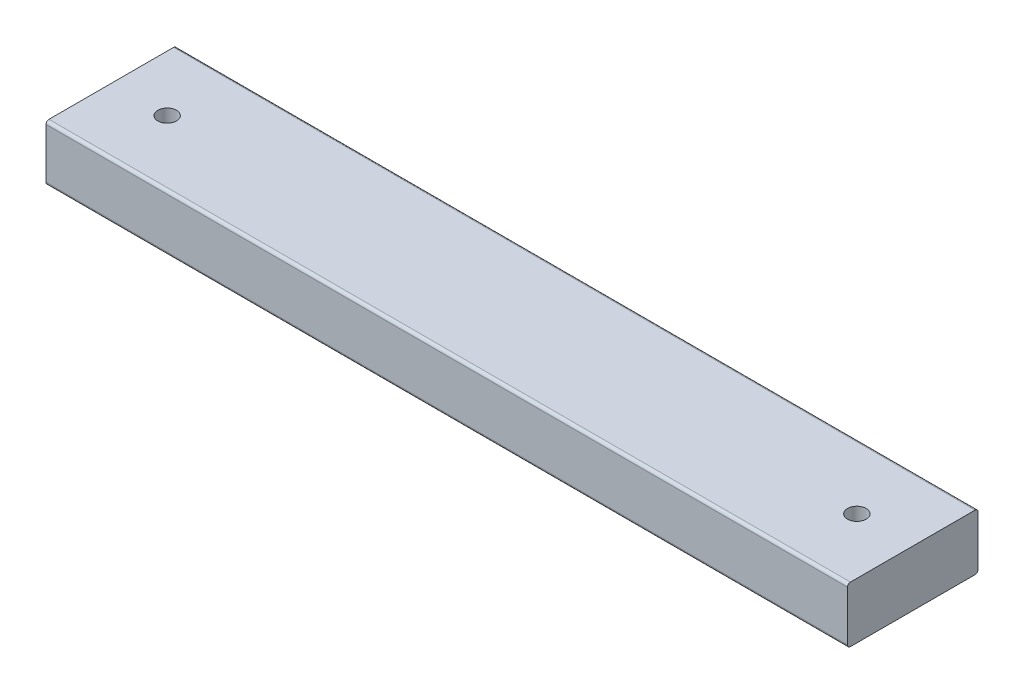
ISO-10303-21;
HEADER;
FILE_DESCRIPTION(('STEP AP214'),'2;1');
FILE_NAME('part.step','',(''),(''),'','','');
FILE_SCHEMA(('AUTOMOTIVE_DESIGN { 1 0 10303 214 1 1 1 1 }'));
ENDSEC;
DATA;
#1=APPLICATION_CONTEXT('core data for automotive mechanical design processes');
#2=APPLICATION_PROTOCOL_DEFINITION('international standard','automotive_design',2000,#1);
#3=PRODUCT_CONTEXT('',#1,'mechanical');
#4=PRODUCT('Part','Part','',(#3));
#5=PRODUCT_RELATED_PRODUCT_CATEGORY('part','',(#4));
#6=PRODUCT_DEFINITION_FORMATION('','',#4);
#7=PRODUCT_DEFINITION_CONTEXT('part definition',#1,'design');
#8=PRODUCT_DEFINITION('design','',#6,#7);
#9=PRODUCT_DEFINITION_SHAPE('','',#8);
#10=(LENGTH_UNIT() NAMED_UNIT(*) SI_UNIT(.MILLI.,.METRE.));
#11=(NAMED_UNIT(*) PLANE_ANGLE_UNIT() SI_UNIT($,.RADIAN.));
#12=(NAMED_UNIT(*) SI_UNIT($,.STERADIAN.) SOLID_ANGLE_UNIT());
#13=UNCERTAINTY_MEASURE_WITH_UNIT(LENGTH_MEASURE(1.E-05),#10,'distance_accuracy_value','');
#14=(GEOMETRIC_REPRESENTATION_CONTEXT(3) GLOBAL_UNCERTAINTY_ASSIGNED_CONTEXT((#13)) GLOBAL_UNIT_ASSIGNED_CONTEXT((#10,
#11,#12)) REPRESENTATION_CONTEXT('',''));
#15=CARTESIAN_POINT('',(0.,0.,0.));
#16=DIRECTION('',(0.,0.,1.));
#17=DIRECTION('',(1.,0.,0.));
#18=AXIS2_PLACEMENT_3D('',#15,#16,#17);
#19=CARTESIAN_POINT('',(546.1,-19.05,-44.45));
#20=DIRECTION('',(0.,0.,1.));
#21=DIRECTION('',(1.,0.,0.));
#22=AXIS2_PLACEMENT_3D('',#19,#20,#21);
#23=PLANE('',#22);
#24=DIRECTION('',(0.,1.,0.));
#25=VECTOR('',#24,1.);
#26=CARTESIAN_POINT('',(0.,-19.05,-44.45));
#27=LINE('',#26,#25);
#28=CARTESIAN_POINT('',(0.,-17.05,-44.45));
#29=VERTEX_POINT('',#28);
#30=CARTESIAN_POINT('',(0.,17.05,-44.45));
#31=VERTEX_POINT('',#30);
#32=EDGE_CURVE('E129',#29,#31,#27,.T.);
#33=ORIENTED_EDGE('',*,*,#32,.T.);
#34=DIRECTION('',(-1.,0.,0.));
#35=VECTOR('',#34,1.);
#36=CARTESIAN_POINT('',(546.1,17.05,-44.45));
#37=LINE('',#36,#35);
#38=CARTESIAN_POINT('',(546.1,17.05,-44.45));
#39=VERTEX_POINT('',#38);
#40=EDGE_CURVE('E152',#31,#39,#37,.F.);
#41=ORIENTED_EDGE('',*,*,#40,.T.);
#42=DIRECTION('',(0.,1.,0.));
#43=VECTOR('',#42,1.);
#44=CARTESIAN_POINT('',(546.1,-19.05,-44.45));
#45=LINE('',#44,#43);
#46=CARTESIAN_POINT('',(546.1,-17.05,-44.45));
#47=VERTEX_POINT('',#46);
#48=EDGE_CURVE('E127',#47,#39,#45,.T.);
#49=ORIENTED_EDGE('',*,*,#48,.F.);
#50=DIRECTION('',(-1.,0.,0.));
#51=VECTOR('',#50,1.);
#52=CARTESIAN_POINT('',(546.1,-17.05,-44.45));
#53=LINE('',#52,#51);
#54=EDGE_CURVE('E149',#47,#29,#53,.T.);
#55=ORIENTED_EDGE('',*,*,#54,.T.);
#56=EDGE_LOOP('',(#33,#41,#49,#55));
#57=FACE_BOUND('',#56,.T.);
#58=ADVANCED_FACE('F34',(#57),#23,.F.);
#59=CARTESIAN_POINT('',(546.1,19.05,44.45));
#60=DIRECTION('',(0.,-1.,0.));
#61=DIRECTION('',(0.,0.,-1.));
#62=AXIS2_PLACEMENT_3D('',#59,#60,#61);
#63=PLANE('',#62);
#64=CARTESIAN_POINT('',(508.,19.05,0.));
#65=DIRECTION('',(0.,1.,0.));
#66=DIRECTION('',(0.,0.,1.));
#67=AXIS2_PLACEMENT_3D('',#64,#65,#66);
#68=CIRCLE('',#67,6.34999999999994);
#69=CARTESIAN_POINT('',(508.,19.05,6.34999999999993));
#70=VERTEX_POINT('',#69);
#71=EDGE_CURVE('E184',#70,#70,#68,.T.);
#72=ORIENTED_EDGE('',*,*,#71,.F.);
#73=EDGE_LOOP('',(#72));
#74=FACE_BOUND('',#73,.T.);
#75=CARTESIAN_POINT('',(38.1000000000002,19.05,0.));
#76=DIRECTION('',(0.,1.,0.));
#77=DIRECTION('',(0.,0.,1.));
#78=AXIS2_PLACEMENT_3D('',#75,#76,#77);
#79=CIRCLE('',#78,6.35);
#80=CARTESIAN_POINT('',(38.1000000000002,19.05,6.35));
#81=VERTEX_POINT('',#80);
#82=EDGE_CURVE('E173',#81,#81,#79,.T.);
#83=ORIENTED_EDGE('',*,*,#82,.F.);
#84=EDGE_LOOP('',(#83));
#85=FACE_BOUND('',#84,.T.);
#86=DIRECTION('',(0.,0.,1.));
#87=VECTOR('',#86,1.);
#88=CARTESIAN_POINT('',(0.,19.05,44.45));
#89=LINE('',#88,#87);
#90=CARTESIAN_POINT('',(0.,19.05,-42.45));
#91=VERTEX_POINT('',#90);
#92=CARTESIAN_POINT('',(0.,19.05,42.45));
#93=VERTEX_POINT('',#92);
#94=EDGE_CURVE('E125',#91,#93,#89,.T.);
#95=ORIENTED_EDGE('',*,*,#94,.T.);
#96=DIRECTION('',(-1.,0.,0.));
#97=VECTOR('',#96,1.);
#98=CARTESIAN_POINT('',(546.1,19.05,42.45));
#99=LINE('',#98,#97);
#100=CARTESIAN_POINT('',(546.1,19.05,42.45));
#101=VERTEX_POINT('',#100);
#102=EDGE_CURVE('E104',#93,#101,#99,.F.);
#103=ORIENTED_EDGE('',*,*,#102,.T.);
#104=DIRECTION('',(0.,0.,1.));
#105=VECTOR('',#104,1.);
#106=CARTESIAN_POINT('',(546.1,19.05,44.45));
#107=LINE('',#106,#105);
#108=CARTESIAN_POINT('',(546.1,19.05,-42.45));
#109=VERTEX_POINT('',#108);
#110=EDGE_CURVE('E168',#109,#101,#107,.T.);
#111=ORIENTED_EDGE('',*,*,#110,.F.);
#112=DIRECTION('',(-1.,0.,0.));
#113=VECTOR('',#112,1.);
#114=CARTESIAN_POINT('',(546.1,19.05,-42.45));
#115=LINE('',#114,#113);
#116=EDGE_CURVE('E109',#109,#91,#115,.T.);
#117=ORIENTED_EDGE('',*,*,#116,.T.);
#118=EDGE_LOOP('',(#95,#103,#111,#117));
#119=FACE_BOUND('',#118,.T.);
#120=ADVANCED_FACE('F198',(#74,#85,#119),#63,.F.);
#121=CARTESIAN_POINT('',(546.1,-19.05,44.45));
#122=DIRECTION('',(0.,0.,-1.));
#123=DIRECTION('',(-1.,0.,0.));
#124=AXIS2_PLACEMENT_3D('',#121,#122,#123);
#125=PLANE('',#124);
#126=DIRECTION('',(0.,-1.,0.));
#127=VECTOR('',#126,1.);
#128=CARTESIAN_POINT('',(546.1,-19.05,44.45));
#129=LINE('',#128,#127);
#130=CARTESIAN_POINT('',(546.1,17.05,44.45));
#131=VERTEX_POINT('',#130);
#132=CARTESIAN_POINT('',(546.1,-17.05,44.45));
#133=VERTEX_POINT('',#132);
#134=EDGE_CURVE('E118',#131,#133,#129,.T.);
#135=ORIENTED_EDGE('',*,*,#134,.F.);
#136=DIRECTION('',(-1.,0.,0.));
#137=VECTOR('',#136,1.);
#138=CARTESIAN_POINT('',(546.1,17.05,44.45));
#139=LINE('',#138,#137);
#140=CARTESIAN_POINT('',(0.,17.05,44.45));
#141=VERTEX_POINT('',#140);
#142=EDGE_CURVE('E103',#131,#141,#139,.T.);
#143=ORIENTED_EDGE('',*,*,#142,.T.);
#144=DIRECTION('',(0.,-1.,0.));
#145=VECTOR('',#144,1.);
#146=CARTESIAN_POINT('',(0.,-19.05,44.45));
#147=LINE('',#146,#145);
#148=CARTESIAN_POINT('',(0.,-17.05,44.45));
#149=VERTEX_POINT('',#148);
#150=EDGE_CURVE('E116',#141,#149,#147,.T.);
#151=ORIENTED_EDGE('',*,*,#150,.T.);
#152=DIRECTION('',(-1.,0.,0.));
#153=VECTOR('',#152,1.);
#154=CARTESIAN_POINT('',(546.1,-17.05,44.45));
#155=LINE('',#154,#153);
#156=EDGE_CURVE('E120',#149,#133,#155,.F.);
#157=ORIENTED_EDGE('',*,*,#156,.T.);
#158=EDGE_LOOP('',(#135,#143,#151,#157));
#159=FACE_BOUND('',#158,.T.);
#160=ADVANCED_FACE('F115',(#159),#125,.F.);
#161=CARTESIAN_POINT('',(546.1,-19.05,44.45));
#162=DIRECTION('',(0.,1.,0.));
#163=DIRECTION('',(0.,0.,1.));
#164=AXIS2_PLACEMENT_3D('',#161,#162,#163);
#165=PLANE('',#164);
#166=CARTESIAN_POINT('',(508.,-19.05,0.));
#167=DIRECTION('',(0.,1.,0.));
#168=DIRECTION('',(0.,0.,1.));
#169=AXIS2_PLACEMENT_3D('',#166,#167,#168);
#170=CIRCLE('',#169,6.34999999999994);
#171=CARTESIAN_POINT('',(508.,-19.05,6.34999999999993));
#172=VERTEX_POINT('',#171);
#173=EDGE_CURVE('E182',#172,#172,#170,.T.);
#174=ORIENTED_EDGE('',*,*,#173,.T.);
#175=EDGE_LOOP('',(#174));
#176=FACE_BOUND('',#175,.T.);
#177=CARTESIAN_POINT('',(38.1000000000002,-19.05,0.));
#178=DIRECTION('',(0.,1.,0.));
#179=DIRECTION('',(0.,0.,1.));
#180=AXIS2_PLACEMENT_3D('',#177,#178,#179);
#181=CIRCLE('',#180,6.35);
#182=CARTESIAN_POINT('',(38.1000000000002,-19.05,6.35));
#183=VERTEX_POINT('',#182);
#184=EDGE_CURVE('E177',#183,#183,#181,.T.);
#185=ORIENTED_EDGE('',*,*,#184,.T.);
#186=EDGE_LOOP('',(#185));
#187=FACE_BOUND('',#186,.T.);
#188=DIRECTION('',(0.,0.,-1.));
#189=VECTOR('',#188,1.);
#190=CARTESIAN_POINT('',(0.,-19.05,44.45));
#191=LINE('',#190,#189);
#192=CARTESIAN_POINT('',(0.,-19.05,42.45));
#193=VERTEX_POINT('',#192);
#194=CARTESIAN_POINT('',(0.,-19.05,-42.45));
#195=VERTEX_POINT('',#194);
#196=EDGE_CURVE('E124',#193,#195,#191,.T.);
#197=ORIENTED_EDGE('',*,*,#196,.T.);
#198=DIRECTION('',(-1.,0.,0.));
#199=VECTOR('',#198,1.);
#200=CARTESIAN_POINT('',(546.1,-19.05,-42.45));
#201=LINE('',#200,#199);
#202=CARTESIAN_POINT('',(546.1,-19.05,-42.45));
#203=VERTEX_POINT('',#202);
#204=EDGE_CURVE('E11',#195,#203,#201,.F.);
#205=ORIENTED_EDGE('',*,*,#204,.T.);
#206=DIRECTION('',(0.,0.,-1.));
#207=VECTOR('',#206,1.);
#208=CARTESIAN_POINT('',(546.1,-19.05,44.45));
#209=LINE('',#208,#207);
#210=CARTESIAN_POINT('',(546.1,-19.05,42.45));
#211=VERTEX_POINT('',#210);
#212=EDGE_CURVE('E133',#211,#203,#209,.T.);
#213=ORIENTED_EDGE('',*,*,#212,.F.);
#214=DIRECTION('',(-1.,0.,0.));
#215=VECTOR('',#214,1.);
#216=CARTESIAN_POINT('',(546.1,-19.05,42.45));
#217=LINE('',#216,#215);
#218=EDGE_CURVE('E42',#211,#193,#217,.T.);
#219=ORIENTED_EDGE('',*,*,#218,.T.);
#220=EDGE_LOOP('',(#197,#205,#213,#219));
#221=FACE_BOUND('',#220,.T.);
#222=ADVANCED_FACE('F155',(#176,#187,#221),#165,.F.);
#223=CARTESIAN_POINT('',(546.1,0.,0.));
#224=DIRECTION('',(-1.,0.,0.));
#225=DIRECTION('',(0.,0.,1.));
#226=AXIS2_PLACEMENT_3D('',#223,#224,#225);
#227=PLANE('',#226);
#228=ORIENTED_EDGE('',*,*,#110,.T.);
#229=CARTESIAN_POINT('',(546.1,17.05,42.45));
#230=DIRECTION('',(-1.,0.,0.));
#231=DIRECTION('',(0.,0.,1.));
#232=AXIS2_PLACEMENT_3D('',#229,#230,#231);
#233=CIRCLE('',#232,2.);
#234=EDGE_CURVE('E147',#101,#131,#233,.F.);
#235=ORIENTED_EDGE('',*,*,#234,.T.);
#236=ORIENTED_EDGE('',*,*,#134,.T.);
#237=CARTESIAN_POINT('',(546.1,-17.05,42.45));
#238=DIRECTION('',(-1.,0.,0.));
#239=DIRECTION('',(0.,0.,1.));
#240=AXIS2_PLACEMENT_3D('',#237,#238,#239);
#241=CIRCLE('',#240,2.);
#242=EDGE_CURVE('E54',#133,#211,#241,.F.);
#243=ORIENTED_EDGE('',*,*,#242,.T.);
#244=ORIENTED_EDGE('',*,*,#212,.T.);
#245=CARTESIAN_POINT('',(546.1,-17.05,-42.45));
#246=DIRECTION('',(-1.,0.,0.));
#247=DIRECTION('',(0.,0.,1.));
#248=AXIS2_PLACEMENT_3D('',#245,#246,#247);
#249=CIRCLE('',#248,2.);
#250=EDGE_CURVE('E143',#203,#47,#249,.F.);
#251=ORIENTED_EDGE('',*,*,#250,.T.);
#252=ORIENTED_EDGE('',*,*,#48,.T.);
#253=CARTESIAN_POINT('',(546.1,17.05,-42.45));
#254=DIRECTION('',(-1.,0.,0.));
#255=DIRECTION('',(0.,0.,1.));
#256=AXIS2_PLACEMENT_3D('',#253,#254,#255);
#257=CIRCLE('',#256,2.);
#258=EDGE_CURVE('E145',#39,#109,#257,.F.);
#259=ORIENTED_EDGE('',*,*,#258,.T.);
#260=EDGE_LOOP('',(#228,#235,#236,#243,#244,#251,#252,#259));
#261=FACE_BOUND('',#260,.T.);
#262=ADVANCED_FACE('F208',(#261),#227,.F.);
#263=CARTESIAN_POINT('',(0.,0.,0.));
#264=DIRECTION('',(-1.,0.,0.));
#265=DIRECTION('',(0.,0.,1.));
#266=AXIS2_PLACEMENT_3D('',#263,#264,#265);
#267=PLANE('',#266);
#268=ORIENTED_EDGE('',*,*,#150,.F.);
#269=CARTESIAN_POINT('',(0.,17.05,42.45));
#270=DIRECTION('',(-1.,0.,0.));
#271=DIRECTION('',(0.,0.,1.));
#272=AXIS2_PLACEMENT_3D('',#269,#270,#271);
#273=CIRCLE('',#272,2.);
#274=EDGE_CURVE('E99',#141,#93,#273,.T.);
#275=ORIENTED_EDGE('',*,*,#274,.T.);
#276=ORIENTED_EDGE('',*,*,#94,.F.);
#277=CARTESIAN_POINT('',(0.,17.05,-42.45));
#278=DIRECTION('',(-1.,0.,0.));
#279=DIRECTION('',(0.,0.,1.));
#280=AXIS2_PLACEMENT_3D('',#277,#278,#279);
#281=CIRCLE('',#280,2.);
#282=EDGE_CURVE('E110',#91,#31,#281,.T.);
#283=ORIENTED_EDGE('',*,*,#282,.T.);
#284=ORIENTED_EDGE('',*,*,#32,.F.);
#285=CARTESIAN_POINT('',(0.,-17.05,-42.45));
#286=DIRECTION('',(-1.,0.,0.));
#287=DIRECTION('',(0.,0.,1.));
#288=AXIS2_PLACEMENT_3D('',#285,#286,#287);
#289=CIRCLE('',#288,2.);
#290=EDGE_CURVE('E136',#29,#195,#289,.T.);
#291=ORIENTED_EDGE('',*,*,#290,.T.);
#292=ORIENTED_EDGE('',*,*,#196,.F.);
#293=CARTESIAN_POINT('',(0.,-17.05,42.45));
#294=DIRECTION('',(-1.,0.,0.));
#295=DIRECTION('',(0.,0.,1.));
#296=AXIS2_PLACEMENT_3D('',#293,#294,#295);
#297=CIRCLE('',#296,2.);
#298=EDGE_CURVE('E119',#193,#149,#297,.T.);
#299=ORIENTED_EDGE('',*,*,#298,.T.);
#300=EDGE_LOOP('',(#268,#275,#276,#283,#284,#291,#292,#299));
#301=FACE_BOUND('',#300,.T.);
#302=ADVANCED_FACE('F122',(#301),#267,.T.);
#303=CARTESIAN_POINT('',(546.1,17.05,42.45));
#304=DIRECTION('',(-1.,0.,0.));
#305=DIRECTION('',(0.,0.,1.));
#306=AXIS2_PLACEMENT_3D('',#303,#304,#305);
#307=CYLINDRICAL_SURFACE('',#306,2.);
#308=ORIENTED_EDGE('',*,*,#234,.F.);
#309=ORIENTED_EDGE('',*,*,#102,.F.);
#310=ORIENTED_EDGE('',*,*,#274,.F.);
#311=ORIENTED_EDGE('',*,*,#142,.F.);
#312=EDGE_LOOP('',(#308,#309,#310,#311));
#313=FACE_BOUND('',#312,.T.);
#314=ADVANCED_FACE('F102',(#313),#307,.T.);
#315=CARTESIAN_POINT('',(546.1,17.05,-42.45));
#316=DIRECTION('',(-1.,0.,0.));
#317=DIRECTION('',(0.,0.,1.));
#318=AXIS2_PLACEMENT_3D('',#315,#316,#317);
#319=CYLINDRICAL_SURFACE('',#318,2.);
#320=ORIENTED_EDGE('',*,*,#258,.F.);
#321=ORIENTED_EDGE('',*,*,#40,.F.);
#322=ORIENTED_EDGE('',*,*,#282,.F.);
#323=ORIENTED_EDGE('',*,*,#116,.F.);
#324=EDGE_LOOP('',(#320,#321,#322,#323));
#325=FACE_BOUND('',#324,.T.);
#326=ADVANCED_FACE('F207',(#325),#319,.T.);
#327=CARTESIAN_POINT('',(546.1,-17.05,-42.45));
#328=DIRECTION('',(-1.,0.,0.));
#329=DIRECTION('',(0.,0.,1.));
#330=AXIS2_PLACEMENT_3D('',#327,#328,#329);
#331=CYLINDRICAL_SURFACE('',#330,2.);
#332=ORIENTED_EDGE('',*,*,#250,.F.);
#333=ORIENTED_EDGE('',*,*,#204,.F.);
#334=ORIENTED_EDGE('',*,*,#290,.F.);
#335=ORIENTED_EDGE('',*,*,#54,.F.);
#336=EDGE_LOOP('',(#332,#333,#334,#335));
#337=FACE_BOUND('',#336,.T.);
#338=ADVANCED_FACE('F162',(#337),#331,.T.);
#339=CARTESIAN_POINT('',(546.1,-17.05,42.45));
#340=DIRECTION('',(-1.,0.,0.));
#341=DIRECTION('',(0.,0.,1.));
#342=AXIS2_PLACEMENT_3D('',#339,#340,#341);
#343=CYLINDRICAL_SURFACE('',#342,2.);
#344=ORIENTED_EDGE('',*,*,#242,.F.);
#345=ORIENTED_EDGE('',*,*,#156,.F.);
#346=ORIENTED_EDGE('',*,*,#298,.F.);
#347=ORIENTED_EDGE('',*,*,#218,.F.);
#348=EDGE_LOOP('',(#344,#345,#346,#347));
#349=FACE_BOUND('',#348,.T.);
#350=ADVANCED_FACE('F36',(#349),#343,.T.);
#351=CARTESIAN_POINT('',(38.1000000000002,-19.05,0.));
#352=DIRECTION('',(0.,1.,0.));
#353=DIRECTION('',(0.,0.,1.));
#354=AXIS2_PLACEMENT_3D('',#351,#352,#353);
#355=CYLINDRICAL_SURFACE('',#354,6.35);
#356=ORIENTED_EDGE('',*,*,#184,.F.);
#357=EDGE_LOOP('',(#356));
#358=FACE_BOUND('',#357,.T.);
#359=ORIENTED_EDGE('',*,*,#82,.T.);
#360=EDGE_LOOP('',(#359));
#361=FACE_BOUND('',#360,.T.);
#362=ADVANCED_FACE('F194',(#358,#361),#355,.F.);
#363=CARTESIAN_POINT('',(508.,-19.05,0.));
#364=DIRECTION('',(0.,1.,0.));
#365=DIRECTION('',(0.,0.,1.));
#366=AXIS2_PLACEMENT_3D('',#363,#364,#365);
#367=CYLINDRICAL_SURFACE('',#366,6.34999999999994);
#368=ORIENTED_EDGE('',*,*,#173,.F.);
#369=EDGE_LOOP('',(#368));
#370=FACE_BOUND('',#369,.T.);
#371=ORIENTED_EDGE('',*,*,#71,.T.);
#372=EDGE_LOOP('',(#371));
#373=FACE_BOUND('',#372,.T.);
#374=ADVANCED_FACE('F191',(#370,#373),#367,.F.);
#375=CLOSED_SHELL('',(#58,#120,#160,#222,#262,#302,#314,#326,#338,#350,#362,#374));
#376=MANIFOLD_SOLID_BREP('B2',#375);
#377=ADVANCED_BREP_SHAPE_REPRESENTATION('',(#18,#376),#14);
#378=SHAPE_DEFINITION_REPRESENTATION(#9,#377);
ENDSEC;
END-ISO-10303-21;
